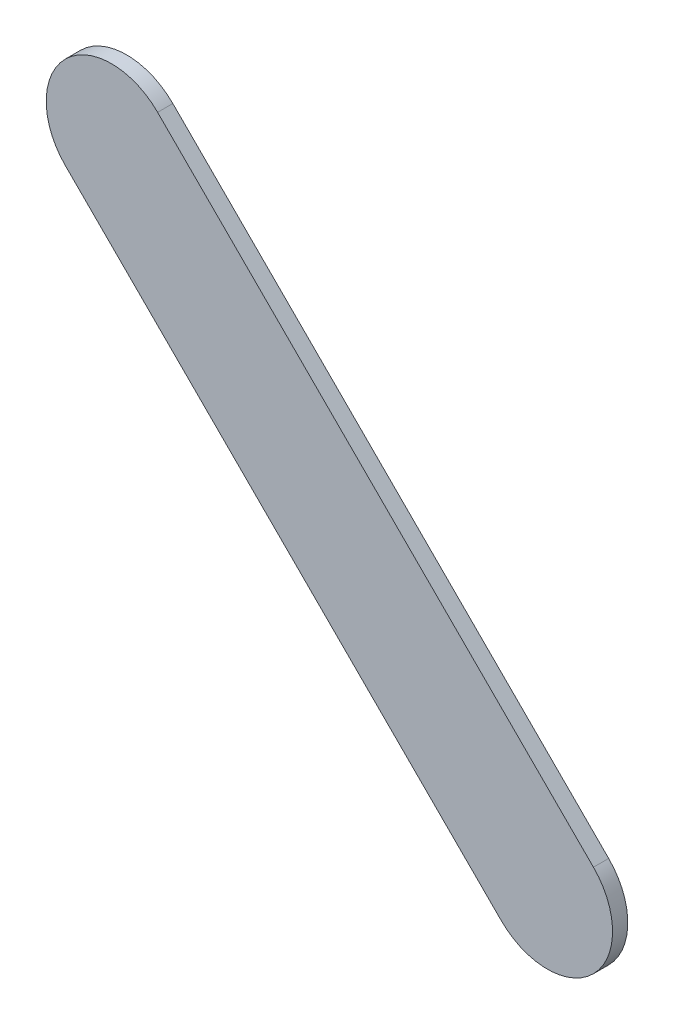
ISO-10303-21;
HEADER;
FILE_DESCRIPTION(('STEP AP214'),'2;1');
FILE_NAME('part.step','',(''),(''),'','','');
FILE_SCHEMA(('AUTOMOTIVE_DESIGN { 1 0 10303 214 1 1 1 1 }'));
ENDSEC;
DATA;
#1=APPLICATION_CONTEXT('core data for automotive mechanical design processes');
#2=APPLICATION_PROTOCOL_DEFINITION('international standard','automotive_design',2000,#1);
#3=PRODUCT_CONTEXT('',#1,'mechanical');
#4=PRODUCT('Part','Part','',(#3));
#5=PRODUCT_RELATED_PRODUCT_CATEGORY('part','',(#4));
#6=PRODUCT_DEFINITION_FORMATION('','',#4);
#7=PRODUCT_DEFINITION_CONTEXT('part definition',#1,'design');
#8=PRODUCT_DEFINITION('design','',#6,#7);
#9=PRODUCT_DEFINITION_SHAPE('','',#8);
#10=(LENGTH_UNIT() NAMED_UNIT(*) SI_UNIT(.MILLI.,.METRE.));
#11=(NAMED_UNIT(*) PLANE_ANGLE_UNIT() SI_UNIT($,.RADIAN.));
#12=(NAMED_UNIT(*) SI_UNIT($,.STERADIAN.) SOLID_ANGLE_UNIT());
#13=UNCERTAINTY_MEASURE_WITH_UNIT(LENGTH_MEASURE(1.E-05),#10,'distance_accuracy_value','');
#14=(GEOMETRIC_REPRESENTATION_CONTEXT(3) GLOBAL_UNCERTAINTY_ASSIGNED_CONTEXT((#13)) GLOBAL_UNIT_ASSIGNED_CONTEXT((#10,
#11,#12)) REPRESENTATION_CONTEXT('',''));
#15=CARTESIAN_POINT('',(0.,0.,0.));
#16=DIRECTION('',(0.,0.,1.));
#17=DIRECTION('',(1.,0.,0.));
#18=AXIS2_PLACEMENT_3D('',#15,#16,#17);
#19=CARTESIAN_POINT('',(118.961066,-66.278933,1.635));
#20=DIRECTION('',(0.,0.,1.));
#21=DIRECTION('',(1.,0.,0.));
#22=AXIS2_PLACEMENT_3D('',#19,#20,#21);
#23=PLANE('',#22);
#24=DIRECTION('',(-0.707106781186548,0.707106781186548,0.));
#25=VECTOR('',#24,1.);
#26=CARTESIAN_POINT('',(118.961066,-66.278933,1.635));
#27=LINE('',#26,#25);
#28=CARTESIAN_POINT('',(118.961066,-66.278933,1.635));
#29=VERTEX_POINT('',#28);
#30=CARTESIAN_POINT('',(117.959066,-65.276933,1.635));
#31=VERTEX_POINT('',#30);
#32=EDGE_CURVE('E79',#29,#31,#27,.T.);
#33=ORIENTED_EDGE('',*,*,#32,.T.);
#34=CARTESIAN_POINT('',(117.8529995,-65.3829995,1.635));
#35=DIRECTION('',(0.,0.,1.));
#36=DIRECTION('',(0.707106781186548,0.707106781186548,0.));
#37=AXIS2_PLACEMENT_3D('',#34,#35,#36);
#38=CIRCLE('',#37,0.150000682813);
#39=CARTESIAN_POINT('',(117.746933,-65.489066,1.635));
#40=VERTEX_POINT('',#39);
#41=EDGE_CURVE('E77',#31,#40,#38,.T.);
#42=ORIENTED_EDGE('',*,*,#41,.T.);
#43=DIRECTION('',(0.707106781186548,-0.707106781186548,0.));
#44=VECTOR('',#43,1.);
#45=CARTESIAN_POINT('',(117.746933,-65.489066,1.635));
#46=LINE('',#45,#44);
#47=CARTESIAN_POINT('',(118.748933,-66.491066,1.635));
#48=VERTEX_POINT('',#47);
#49=EDGE_CURVE('E65',#40,#48,#46,.T.);
#50=ORIENTED_EDGE('',*,*,#49,.T.);
#51=CARTESIAN_POINT('',(118.8549995,-66.3849995,1.635));
#52=DIRECTION('',(0.,0.,1.));
#53=DIRECTION('',(-0.707106781186548,-0.707106781186548,0.));
#54=AXIS2_PLACEMENT_3D('',#51,#52,#53);
#55=CIRCLE('',#54,0.150000682813);
#56=EDGE_CURVE('E11',#48,#29,#55,.T.);
#57=ORIENTED_EDGE('',*,*,#56,.T.);
#58=EDGE_LOOP('',(#33,#42,#50,#57));
#59=FACE_BOUND('',#58,.T.);
#60=ADVANCED_FACE('F17',(#59),#23,.T.);
#61=CARTESIAN_POINT('',(118.961066,-66.278933,1.6));
#62=DIRECTION('',(0.,0.,1.));
#63=DIRECTION('',(1.,0.,0.));
#64=AXIS2_PLACEMENT_3D('',#61,#62,#63);
#65=PLANE('',#64);
#66=CARTESIAN_POINT('',(118.8549995,-66.3849995,1.6));
#67=DIRECTION('',(0.,0.,1.));
#68=DIRECTION('',(-0.707106781186548,-0.707106781186548,0.));
#69=AXIS2_PLACEMENT_3D('',#66,#67,#68);
#70=CIRCLE('',#69,0.150000682813);
#71=CARTESIAN_POINT('',(118.748933,-66.491066,1.6));
#72=VERTEX_POINT('',#71);
#73=CARTESIAN_POINT('',(118.961066,-66.278933,1.6));
#74=VERTEX_POINT('',#73);
#75=EDGE_CURVE('E26',#72,#74,#70,.T.);
#76=ORIENTED_EDGE('',*,*,#75,.F.);
#77=DIRECTION('',(0.707106781186548,-0.707106781186548,0.));
#78=VECTOR('',#77,1.);
#79=CARTESIAN_POINT('',(117.746933,-65.489066,1.6));
#80=LINE('',#79,#78);
#81=CARTESIAN_POINT('',(117.746933,-65.489066,1.6));
#82=VERTEX_POINT('',#81);
#83=EDGE_CURVE('E84',#82,#72,#80,.T.);
#84=ORIENTED_EDGE('',*,*,#83,.F.);
#85=CARTESIAN_POINT('',(117.8529995,-65.3829995,1.6));
#86=DIRECTION('',(0.,0.,1.));
#87=DIRECTION('',(0.707106781186548,0.707106781186548,0.));
#88=AXIS2_PLACEMENT_3D('',#85,#86,#87);
#89=CIRCLE('',#88,0.150000682813);
#90=CARTESIAN_POINT('',(117.959066,-65.276933,1.6));
#91=VERTEX_POINT('',#90);
#92=EDGE_CURVE('E87',#91,#82,#89,.T.);
#93=ORIENTED_EDGE('',*,*,#92,.F.);
#94=DIRECTION('',(-0.707106781186548,0.707106781186548,0.));
#95=VECTOR('',#94,1.);
#96=CARTESIAN_POINT('',(118.961066,-66.278933,1.6));
#97=LINE('',#96,#95);
#98=EDGE_CURVE('E97',#74,#91,#97,.T.);
#99=ORIENTED_EDGE('',*,*,#98,.F.);
#100=EDGE_LOOP('',(#76,#84,#93,#99));
#101=FACE_BOUND('',#100,.T.);
#102=ADVANCED_FACE('F120',(#101),#65,.F.);
#103=CARTESIAN_POINT('',(118.8549995,-66.3849995,1.6));
#104=DIRECTION('',(0.,0.,-1.));
#105=DIRECTION('',(-0.707106781186548,-0.707106781186548,0.));
#106=AXIS2_PLACEMENT_3D('',#103,#104,#105);
#107=CYLINDRICAL_SURFACE('',#106,0.150000682813);
#108=ORIENTED_EDGE('',*,*,#75,.T.);
#109=DIRECTION('',(0.,0.,1.));
#110=VECTOR('',#109,1.);
#111=CARTESIAN_POINT('',(118.961066,-66.278933,1.6));
#112=LINE('',#111,#110);
#113=EDGE_CURVE('E94',#74,#29,#112,.T.);
#114=ORIENTED_EDGE('',*,*,#113,.T.);
#115=ORIENTED_EDGE('',*,*,#56,.F.);
#116=DIRECTION('',(0.,0.,1.));
#117=VECTOR('',#116,1.);
#118=CARTESIAN_POINT('',(118.748933,-66.491066,1.6));
#119=LINE('',#118,#117);
#120=EDGE_CURVE('E72',#72,#48,#119,.T.);
#121=ORIENTED_EDGE('',*,*,#120,.F.);
#122=EDGE_LOOP('',(#108,#114,#115,#121));
#123=FACE_BOUND('',#122,.T.);
#124=ADVANCED_FACE('F115',(#123),#107,.T.);
#125=CARTESIAN_POINT('',(117.746933,-65.489066,1.6));
#126=DIRECTION('',(0.707106781186548,0.707106781186548,0.));
#127=DIRECTION('',(0.,0.,-1.));
#128=AXIS2_PLACEMENT_3D('',#125,#126,#127);
#129=PLANE('',#128);
#130=ORIENTED_EDGE('',*,*,#83,.T.);
#131=ORIENTED_EDGE('',*,*,#120,.T.);
#132=ORIENTED_EDGE('',*,*,#49,.F.);
#133=DIRECTION('',(0.,0.,1.));
#134=VECTOR('',#133,1.);
#135=CARTESIAN_POINT('',(117.746933,-65.489066,1.6));
#136=LINE('',#135,#134);
#137=EDGE_CURVE('E70',#82,#40,#136,.T.);
#138=ORIENTED_EDGE('',*,*,#137,.F.);
#139=EDGE_LOOP('',(#130,#131,#132,#138));
#140=FACE_BOUND('',#139,.T.);
#141=ADVANCED_FACE('F68',(#140),#129,.F.);
#142=CARTESIAN_POINT('',(117.8529995,-65.3829995,1.6));
#143=DIRECTION('',(0.,0.,-1.));
#144=DIRECTION('',(0.707106781186548,0.707106781186548,0.));
#145=AXIS2_PLACEMENT_3D('',#142,#143,#144);
#146=CYLINDRICAL_SURFACE('',#145,0.150000682813);
#147=ORIENTED_EDGE('',*,*,#92,.T.);
#148=ORIENTED_EDGE('',*,*,#137,.T.);
#149=ORIENTED_EDGE('',*,*,#41,.F.);
#150=DIRECTION('',(0.,0.,1.));
#151=VECTOR('',#150,1.);
#152=CARTESIAN_POINT('',(117.959066,-65.276933,1.6));
#153=LINE('',#152,#151);
#154=EDGE_CURVE('E101',#91,#31,#153,.T.);
#155=ORIENTED_EDGE('',*,*,#154,.F.);
#156=EDGE_LOOP('',(#147,#148,#149,#155));
#157=FACE_BOUND('',#156,.T.);
#158=ADVANCED_FACE('F86',(#157),#146,.T.);
#159=CARTESIAN_POINT('',(118.961066,-66.278933,1.6));
#160=DIRECTION('',(-0.707106781186548,-0.707106781186548,0.));
#161=DIRECTION('',(-0.707106781186548,0.707106781186548,0.));
#162=AXIS2_PLACEMENT_3D('',#159,#160,#161);
#163=PLANE('',#162);
#164=ORIENTED_EDGE('',*,*,#98,.T.);
#165=ORIENTED_EDGE('',*,*,#154,.T.);
#166=ORIENTED_EDGE('',*,*,#32,.F.);
#167=ORIENTED_EDGE('',*,*,#113,.F.);
#168=EDGE_LOOP('',(#164,#165,#166,#167));
#169=FACE_BOUND('',#168,.T.);
#170=ADVANCED_FACE('F119',(#169),#163,.F.);
#171=CLOSED_SHELL('',(#60,#102,#124,#141,#158,#170));
#172=MANIFOLD_SOLID_BREP('B1',#171);
#173=ADVANCED_BREP_SHAPE_REPRESENTATION('',(#18,#172),#14);
#174=SHAPE_DEFINITION_REPRESENTATION(#9,#173);
ENDSEC;
END-ISO-10303-21;
